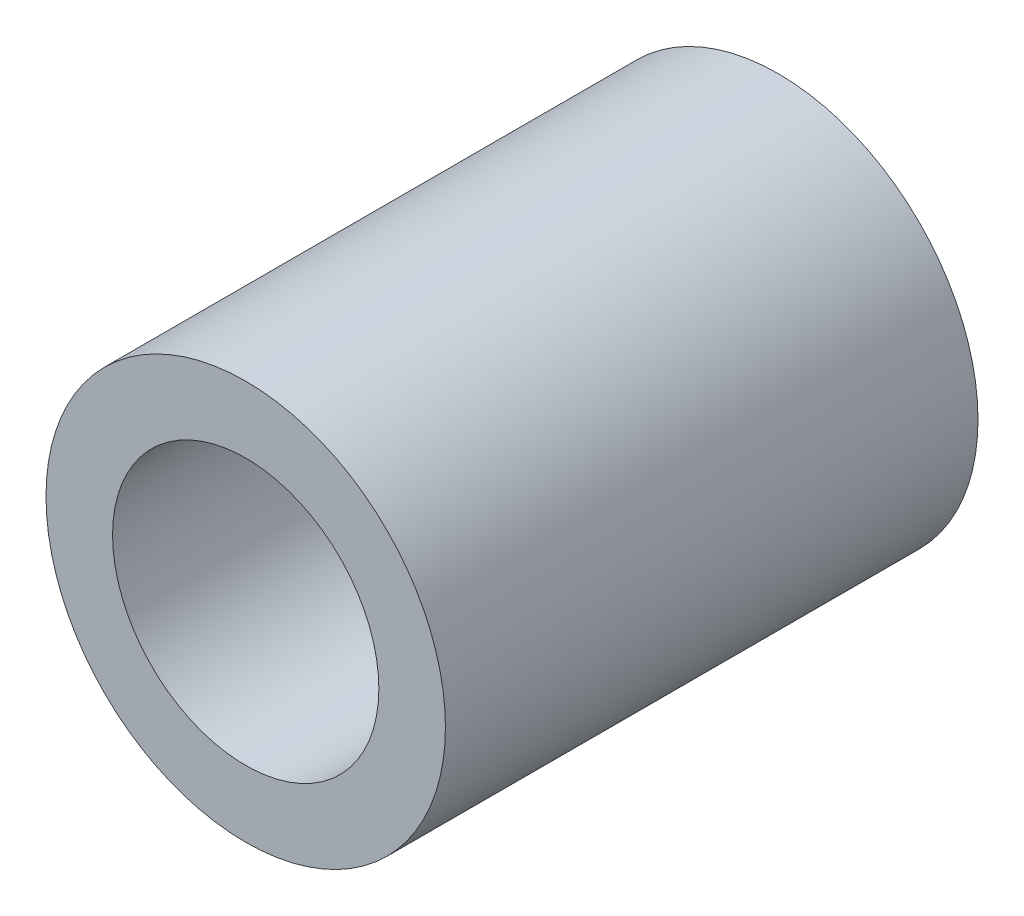
ISO-10303-21;
HEADER;
FILE_DESCRIPTION(('STEP AP214'),'2;1');
FILE_NAME('part.step','',(''),(''),'','','');
FILE_SCHEMA(('AUTOMOTIVE_DESIGN { 1 0 10303 214 1 1 1 1 }'));
ENDSEC;
DATA;
#1=APPLICATION_CONTEXT('core data for automotive mechanical design processes');
#2=APPLICATION_PROTOCOL_DEFINITION('international standard','automotive_design',2000,#1);
#3=PRODUCT_CONTEXT('',#1,'mechanical');
#4=PRODUCT('Part','Part','',(#3));
#5=PRODUCT_RELATED_PRODUCT_CATEGORY('part','',(#4));
#6=PRODUCT_DEFINITION_FORMATION('','',#4);
#7=PRODUCT_DEFINITION_CONTEXT('part definition',#1,'design');
#8=PRODUCT_DEFINITION('design','',#6,#7);
#9=PRODUCT_DEFINITION_SHAPE('','',#8);
#10=(LENGTH_UNIT() NAMED_UNIT(*) SI_UNIT(.MILLI.,.METRE.));
#11=(NAMED_UNIT(*) PLANE_ANGLE_UNIT() SI_UNIT($,.RADIAN.));
#12=(NAMED_UNIT(*) SI_UNIT($,.STERADIAN.) SOLID_ANGLE_UNIT());
#13=UNCERTAINTY_MEASURE_WITH_UNIT(LENGTH_MEASURE(1.E-05),#10,'distance_accuracy_value','');
#14=(GEOMETRIC_REPRESENTATION_CONTEXT(3) GLOBAL_UNCERTAINTY_ASSIGNED_CONTEXT((#13)) GLOBAL_UNIT_ASSIGNED_CONTEXT((#10,
#11,#12)) REPRESENTATION_CONTEXT('',''));
#15=CARTESIAN_POINT('',(0.,0.,0.));
#16=DIRECTION('',(0.,0.,1.));
#17=DIRECTION('',(1.,0.,0.));
#18=AXIS2_PLACEMENT_3D('',#15,#16,#17);
#19=CARTESIAN_POINT('',(0.,0.,-25.4));
#20=DIRECTION('',(0.,0.,1.));
#21=DIRECTION('',(1.,0.,0.));
#22=AXIS2_PLACEMENT_3D('',#19,#20,#21);
#23=CYLINDRICAL_SURFACE('',#22,9.52500000000001);
#24=CARTESIAN_POINT('',(0.,0.,-25.4));
#25=DIRECTION('',(0.,0.,1.));
#26=DIRECTION('',(1.,0.,0.));
#27=AXIS2_PLACEMENT_3D('',#24,#25,#26);
#28=CIRCLE('',#27,9.52500000000001);
#29=CARTESIAN_POINT('',(9.52500000000002,0.,-25.4));
#30=VERTEX_POINT('',#29);
#31=EDGE_CURVE('E10',#30,#30,#28,.T.);
#32=ORIENTED_EDGE('',*,*,#31,.T.);
#33=EDGE_LOOP('',(#32));
#34=FACE_BOUND('',#33,.T.);
#35=CARTESIAN_POINT('',(0.,0.,0.));
#36=DIRECTION('',(0.,0.,1.));
#37=DIRECTION('',(1.,0.,0.));
#38=AXIS2_PLACEMENT_3D('',#35,#36,#37);
#39=CIRCLE('',#38,9.52500000000001);
#40=CARTESIAN_POINT('',(9.52500000000003,0.,0.));
#41=VERTEX_POINT('',#40);
#42=EDGE_CURVE('E33',#41,#41,#39,.T.);
#43=ORIENTED_EDGE('',*,*,#42,.F.);
#44=EDGE_LOOP('',(#43));
#45=FACE_BOUND('',#44,.T.);
#46=ADVANCED_FACE('F30',(#34,#45),#23,.T.);
#47=CARTESIAN_POINT('',(0.,0.,-25.4));
#48=DIRECTION('',(0.,0.,1.));
#49=DIRECTION('',(1.,0.,0.));
#50=AXIS2_PLACEMENT_3D('',#47,#48,#49);
#51=PLANE('',#50);
#52=CARTESIAN_POINT('',(0.,0.,-25.4));
#53=DIRECTION('',(0.,0.,1.));
#54=DIRECTION('',(1.,0.,0.));
#55=AXIS2_PLACEMENT_3D('',#52,#53,#54);
#56=CIRCLE('',#55,6.35);
#57=CARTESIAN_POINT('',(6.35000000000001,0.,-25.4));
#58=VERTEX_POINT('',#57);
#59=EDGE_CURVE('E40',#58,#58,#56,.T.);
#60=ORIENTED_EDGE('',*,*,#59,.T.);
#61=EDGE_LOOP('',(#60));
#62=FACE_BOUND('',#61,.T.);
#63=ORIENTED_EDGE('',*,*,#31,.F.);
#64=EDGE_LOOP('',(#63));
#65=FACE_BOUND('',#64,.T.);
#66=ADVANCED_FACE('F48',(#62,#65),#51,.F.);
#67=CARTESIAN_POINT('',(0.,0.,0.));
#68=DIRECTION('',(0.,0.,1.));
#69=DIRECTION('',(1.,0.,0.));
#70=AXIS2_PLACEMENT_3D('',#67,#68,#69);
#71=PLANE('',#70);
#72=CARTESIAN_POINT('',(0.,0.,0.));
#73=DIRECTION('',(0.,0.,1.));
#74=DIRECTION('',(1.,0.,0.));
#75=AXIS2_PLACEMENT_3D('',#72,#73,#74);
#76=CIRCLE('',#75,6.35);
#77=CARTESIAN_POINT('',(6.35000000000001,0.,0.));
#78=VERTEX_POINT('',#77);
#79=EDGE_CURVE('E42',#78,#78,#76,.T.);
#80=ORIENTED_EDGE('',*,*,#79,.F.);
#81=EDGE_LOOP('',(#80));
#82=FACE_BOUND('',#81,.T.);
#83=ORIENTED_EDGE('',*,*,#42,.T.);
#84=EDGE_LOOP('',(#83));
#85=FACE_BOUND('',#84,.T.);
#86=ADVANCED_FACE('F54',(#82,#85),#71,.T.);
#87=CARTESIAN_POINT('',(0.,0.,-25.4));
#88=DIRECTION('',(0.,0.,1.));
#89=DIRECTION('',(1.,0.,0.));
#90=AXIS2_PLACEMENT_3D('',#87,#88,#89);
#91=CYLINDRICAL_SURFACE('',#90,6.35);
#92=ORIENTED_EDGE('',*,*,#59,.F.);
#93=EDGE_LOOP('',(#92));
#94=FACE_BOUND('',#93,.T.);
#95=ORIENTED_EDGE('',*,*,#79,.T.);
#96=EDGE_LOOP('',(#95));
#97=FACE_BOUND('',#96,.T.);
#98=ADVANCED_FACE('F51',(#94,#97),#91,.F.);
#99=CLOSED_SHELL('',(#46,#66,#86,#98));
#100=MANIFOLD_SOLID_BREP('B2',#99);
#101=ADVANCED_BREP_SHAPE_REPRESENTATION('',(#18,#100),#14);
#102=SHAPE_DEFINITION_REPRESENTATION(#9,#101);
ENDSEC;
END-ISO-10303-21;
